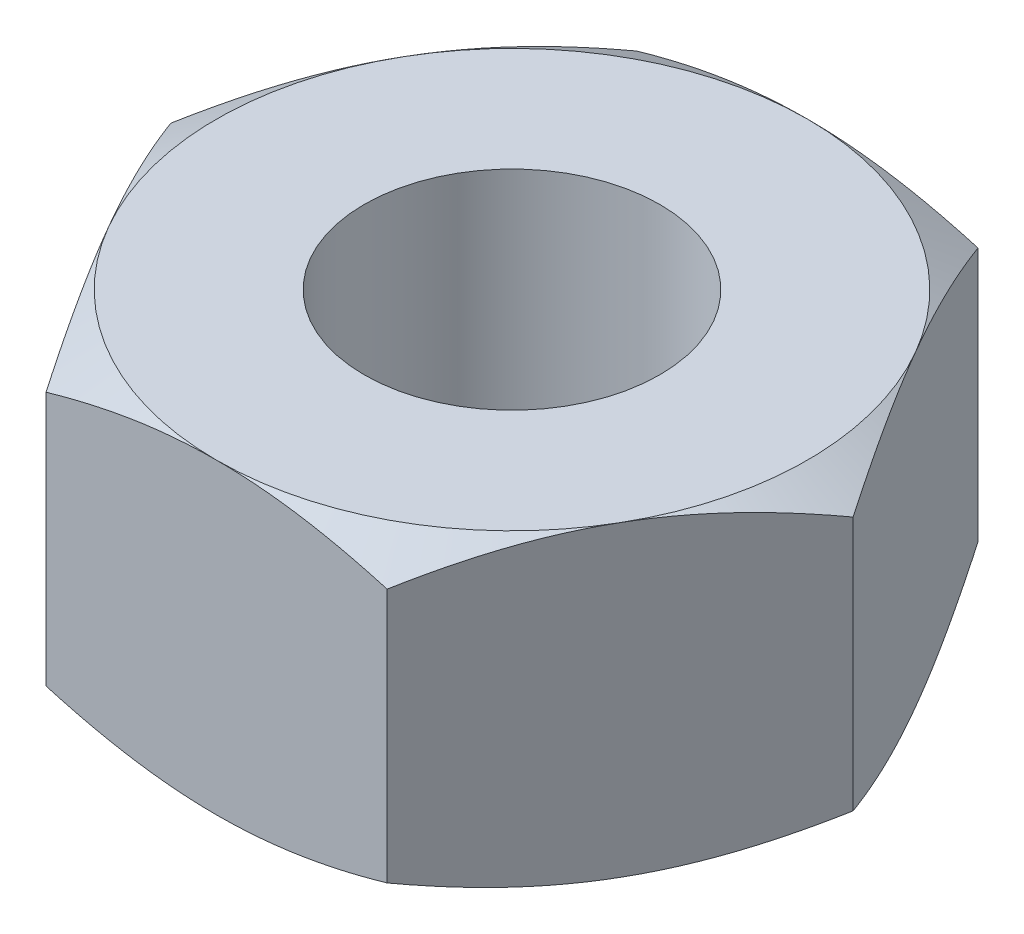
ISO-10303-21;
HEADER;
FILE_DESCRIPTION(('STEP AP214'),'2;1');
FILE_NAME('part.step','',(''),(''),'','','');
FILE_SCHEMA(('AUTOMOTIVE_DESIGN { 1 0 10303 214 1 1 1 1 }'));
ENDSEC;
DATA;
#1=APPLICATION_CONTEXT('core data for automotive mechanical design processes');
#2=APPLICATION_PROTOCOL_DEFINITION('international standard','automotive_design',2000,#1);
#3=PRODUCT_CONTEXT('',#1,'mechanical');
#4=PRODUCT('Part','Part','',(#3));
#5=PRODUCT_RELATED_PRODUCT_CATEGORY('part','',(#4));
#6=PRODUCT_DEFINITION_FORMATION('','',#4);
#7=PRODUCT_DEFINITION_CONTEXT('part definition',#1,'design');
#8=PRODUCT_DEFINITION('design','',#6,#7);
#9=PRODUCT_DEFINITION_SHAPE('','',#8);
#10=(LENGTH_UNIT() NAMED_UNIT(*) SI_UNIT(.MILLI.,.METRE.));
#11=(NAMED_UNIT(*) PLANE_ANGLE_UNIT() SI_UNIT($,.RADIAN.));
#12=(NAMED_UNIT(*) SI_UNIT($,.STERADIAN.) SOLID_ANGLE_UNIT());
#13=UNCERTAINTY_MEASURE_WITH_UNIT(LENGTH_MEASURE(1.E-05),#10,'distance_accuracy_value','');
#14=(GEOMETRIC_REPRESENTATION_CONTEXT(3) GLOBAL_UNCERTAINTY_ASSIGNED_CONTEXT((#13)) GLOBAL_UNIT_ASSIGNED_CONTEXT((#10,
#11,#12)) REPRESENTATION_CONTEXT('',''));
#15=CARTESIAN_POINT('',(0.,0.,0.));
#16=DIRECTION('',(0.,0.,1.));
#17=DIRECTION('',(1.,0.,0.));
#18=AXIS2_PLACEMENT_3D('',#15,#16,#17);
#19=CARTESIAN_POINT('',(0.,-2.6,0.));
#20=DIRECTION('',(0.,1.,0.));
#21=DIRECTION('',(0.,0.,1.));
#22=AXIS2_PLACEMENT_3D('',#19,#20,#21);
#23=PLANE('',#22);
#24=CARTESIAN_POINT('',(0.,-2.6,0.));
#25=DIRECTION('',(0.,1.,0.));
#26=DIRECTION('',(0.,0.,1.));
#27=AXIS2_PLACEMENT_3D('',#24,#25,#26);
#28=CIRCLE('',#27,2.5);
#29=CARTESIAN_POINT('',(0.,-2.6,2.5));
#30=VERTEX_POINT('',#29);
#31=EDGE_CURVE('E337',#30,#30,#28,.T.);
#32=ORIENTED_EDGE('',*,*,#31,.T.);
#33=EDGE_LOOP('',(#32));
#34=FACE_BOUND('',#33,.T.);
#35=CARTESIAN_POINT('',(0.,-2.6,0.));
#36=DIRECTION('',(0.,1.,0.));
#37=DIRECTION('',(0.,0.,1.));
#38=AXIS2_PLACEMENT_3D('',#35,#36,#37);
#39=CIRCLE('',#38,5.);
#40=CARTESIAN_POINT('',(4.3301270189222,-2.6,2.5));
#41=VERTEX_POINT('',#40);
#42=CARTESIAN_POINT('',(0.,-2.6,5.));
#43=VERTEX_POINT('',#42);
#44=EDGE_CURVE('E70',#41,#43,#39,.F.);
#45=ORIENTED_EDGE('',*,*,#44,.T.);
#46=CARTESIAN_POINT('',(-4.3301270189222,-2.6,2.5));
#47=VERTEX_POINT('',#46);
#48=EDGE_CURVE('E148',#43,#47,#39,.F.);
#49=ORIENTED_EDGE('',*,*,#48,.T.);
#50=CARTESIAN_POINT('',(-4.3301270189222,-2.6,-2.50000000000001));
#51=VERTEX_POINT('',#50);
#52=EDGE_CURVE('E286',#47,#51,#39,.F.);
#53=ORIENTED_EDGE('',*,*,#52,.T.);
#54=CARTESIAN_POINT('',(0.,-2.6,-5.00000000000001));
#55=VERTEX_POINT('',#54);
#56=EDGE_CURVE('E291',#51,#55,#39,.F.);
#57=ORIENTED_EDGE('',*,*,#56,.T.);
#58=CARTESIAN_POINT('',(4.33012701892219,-2.6,-2.5));
#59=VERTEX_POINT('',#58);
#60=EDGE_CURVE('E288',#55,#59,#39,.F.);
#61=ORIENTED_EDGE('',*,*,#60,.T.);
#62=EDGE_CURVE('E283',#59,#41,#39,.F.);
#63=ORIENTED_EDGE('',*,*,#62,.T.);
#64=EDGE_LOOP('',(#45,#49,#53,#57,#61,#63));
#65=FACE_BOUND('',#64,.T.);
#66=ADVANCED_FACE('F48',(#34,#65),#23,.F.);
#67=CARTESIAN_POINT('',(0.,2.6,0.));
#68=DIRECTION('',(0.,1.,0.));
#69=DIRECTION('',(0.,0.,1.));
#70=AXIS2_PLACEMENT_3D('',#67,#68,#69);
#71=PLANE('',#70);
#72=CARTESIAN_POINT('',(0.,2.6,0.));
#73=DIRECTION('',(0.,1.,0.));
#74=DIRECTION('',(0.,0.,1.));
#75=AXIS2_PLACEMENT_3D('',#72,#73,#74);
#76=CIRCLE('',#75,2.5);
#77=CARTESIAN_POINT('',(0.,2.6,2.5));
#78=VERTEX_POINT('',#77);
#79=EDGE_CURVE('E168',#78,#78,#76,.T.);
#80=ORIENTED_EDGE('',*,*,#79,.F.);
#81=EDGE_LOOP('',(#80));
#82=FACE_BOUND('',#81,.T.);
#83=CARTESIAN_POINT('',(0.,2.6,0.));
#84=DIRECTION('',(0.,1.,0.));
#85=DIRECTION('',(0.,0.,1.));
#86=AXIS2_PLACEMENT_3D('',#83,#84,#85);
#87=CIRCLE('',#86,5.);
#88=CARTESIAN_POINT('',(0.,2.6,5.));
#89=VERTEX_POINT('',#88);
#90=CARTESIAN_POINT('',(-4.3301270189222,2.6,2.5));
#91=VERTEX_POINT('',#90);
#92=EDGE_CURVE('E328',#89,#91,#87,.F.);
#93=ORIENTED_EDGE('',*,*,#92,.F.);
#94=CARTESIAN_POINT('',(4.3301270189222,2.6,2.5));
#95=VERTEX_POINT('',#94);
#96=EDGE_CURVE('E331',#95,#89,#87,.F.);
#97=ORIENTED_EDGE('',*,*,#96,.F.);
#98=CARTESIAN_POINT('',(4.33012701892219,2.6,-2.5));
#99=VERTEX_POINT('',#98);
#100=EDGE_CURVE('E344',#99,#95,#87,.F.);
#101=ORIENTED_EDGE('',*,*,#100,.F.);
#102=CARTESIAN_POINT('',(0.,2.6,-5.00000000000001));
#103=VERTEX_POINT('',#102);
#104=EDGE_CURVE('E341',#103,#99,#87,.F.);
#105=ORIENTED_EDGE('',*,*,#104,.F.);
#106=CARTESIAN_POINT('',(-4.3301270189222,2.6,-2.50000000000001));
#107=VERTEX_POINT('',#106);
#108=EDGE_CURVE('E339',#107,#103,#87,.F.);
#109=ORIENTED_EDGE('',*,*,#108,.F.);
#110=EDGE_CURVE('E333',#91,#107,#87,.F.);
#111=ORIENTED_EDGE('',*,*,#110,.F.);
#112=EDGE_LOOP('',(#93,#97,#101,#105,#109,#111));
#113=FACE_BOUND('',#112,.T.);
#114=ADVANCED_FACE('F329',(#82,#113),#71,.T.);
#115=CARTESIAN_POINT('',(2.88675134594813,2.6,5.));
#116=DIRECTION('',(-0.866025403784439,0.,-0.5));
#117=DIRECTION('',(-0.5,0.,0.866025403784439));
#118=AXIS2_PLACEMENT_3D('',#115,#116,#117);
#119=PLANE('',#118);
#120=DIRECTION('',(0.,-1.,0.));
#121=VECTOR('',#120,1.);
#122=CARTESIAN_POINT('',(2.88675134594813,2.6,5.));
#123=LINE('',#122,#121);
#124=CARTESIAN_POINT('',(2.88675134594831,2.1534180126149,5.));
#125=VERTEX_POINT('',#124);
#126=CARTESIAN_POINT('',(2.88675134594813,-2.1534180126148,5.));
#127=VERTEX_POINT('',#126);
#128=EDGE_CURVE('E163',#125,#127,#123,.T.);
#129=ORIENTED_EDGE('',*,*,#128,.T.);
#130=CARTESIAN_POINT('',(2.88663587589429,-2.15335134394817,5.0002));
#131=CARTESIAN_POINT('',(3.01349970319368,-2.22661343236236,4.78046540547482));
#132=CARTESIAN_POINT('',(3.14144859993849,-2.29324867808191,4.55885141554042));
#133=CARTESIAN_POINT('',(3.39956193532121,-2.40956100898919,4.11178600454649));
#134=CARTESIAN_POINT('',(3.52973095989718,-2.45919695008421,3.88632664040923));
#135=CARTESIAN_POINT('',(3.78847564779798,-2.5364489745813,3.43816769477649));
#136=CARTESIAN_POINT('',(3.91701101576052,-2.56457962171651,3.21553790689581));
#137=CARTESIAN_POINT('',(4.11026620624322,-2.58980507804632,2.88081009815336));
#138=CARTESIAN_POINT('',(4.17472868879311,-2.59538654023052,2.76915780319494));
#139=CARTESIAN_POINT('',(4.30371322717528,-2.60079778324853,2.5457500293262));
#140=CARTESIAN_POINT('',(4.36823528110589,-2.6006277417418,2.43399455370969));
#141=CARTESIAN_POINT('',(4.54500768479194,-2.59224636820796,2.12781576914936));
#142=CARTESIAN_POINT('',(4.65719946015292,-2.57817022810275,1.93349391403279));
#143=CARTESIAN_POINT('',(4.88083840557981,-2.53353474289057,1.54613989800229));
#144=CARTESIAN_POINT('',(4.9922847895602,-2.50296013985249,1.35310909862843));
#145=CARTESIAN_POINT('',(5.21637431361295,-2.42653150637884,0.964974657525144));
#146=CARTESIAN_POINT('',(5.32898917185759,-2.38035362112132,0.769920001358263));
#147=CARTESIAN_POINT('',(5.55253939626498,-2.27554820550807,0.38271965464123));
#148=CARTESIAN_POINT('',(5.66347762579592,-2.21694529656263,0.190569004591911));
#149=CARTESIAN_POINT('',(5.7736181619501,-2.15335134394817,-0.000200000000002971));
#150=B_SPLINE_CURVE_WITH_KNOTS('',3,(#130,#131,#132,#133,#134,#135,#136,#137,#138,#139,#140,
#141,#142,#143,#144,#145,#146,#147,#148,#149),.UNSPECIFIED.,.F.,.F.,(4,2,2,2,2,2,2,2,2,4),(0.,
0.792555841363092,1.58701660053334,2.36181537487281,2.74884076077326,3.13585419177295,
3.8096236259968,4.4840172390119,5.17336882348929,5.86136694793726),.UNSPECIFIED.);
#151=EDGE_CURVE('E282',#127,#41,#150,.T.);
#152=ORIENTED_EDGE('',*,*,#151,.T.);
#153=CARTESIAN_POINT('',(5.77350269189626,-2.1534180126148,0.));
#154=VERTEX_POINT('',#153);
#155=EDGE_CURVE('E276',#41,#154,#150,.T.);
#156=ORIENTED_EDGE('',*,*,#155,.T.);
#157=DIRECTION('',(0.,-1.,0.));
#158=VECTOR('',#157,1.);
#159=CARTESIAN_POINT('',(5.77350269189626,2.6,0.));
#160=LINE('',#159,#158);
#161=CARTESIAN_POINT('',(5.77350269189626,2.1534180126148,0.));
#162=VERTEX_POINT('',#161);
#163=EDGE_CURVE('E177',#162,#154,#160,.T.);
#164=ORIENTED_EDGE('',*,*,#163,.F.);
#165=CARTESIAN_POINT('',(5.7736181619501,2.15335134394817,-0.000200000000003321));
#166=CARTESIAN_POINT('',(5.64675433465071,2.22661343236237,0.219534594525182));
#167=CARTESIAN_POINT('',(5.5188054379059,2.29324867808191,0.441148584459577));
#168=CARTESIAN_POINT('',(5.26069210252318,2.40956100898919,0.88821399545351));
#169=CARTESIAN_POINT('',(5.13052307794721,2.45919695008421,1.11367335959077));
#170=CARTESIAN_POINT('',(4.87177839004641,2.5364489745813,1.56183230522351));
#171=CARTESIAN_POINT('',(4.74324302208387,2.56457962171651,1.78446209310419));
#172=CARTESIAN_POINT('',(4.54998783160116,2.58980507804632,2.11918990184664));
#173=CARTESIAN_POINT('',(4.48552534905128,2.59538654023052,2.23084219680506));
#174=CARTESIAN_POINT('',(4.35654081066911,2.60079778324853,2.4542499706738));
#175=CARTESIAN_POINT('',(4.2920187567385,2.6006277417418,2.56600544629031));
#176=CARTESIAN_POINT('',(4.11524635305245,2.59224636820796,2.87218423085064));
#177=CARTESIAN_POINT('',(4.00305457769146,2.57817022810275,3.06650608596721));
#178=CARTESIAN_POINT('',(3.77941563226457,2.53353474289057,3.45386010199771));
#179=CARTESIAN_POINT('',(3.66796924828419,2.50296013985249,3.64689090137157));
#180=CARTESIAN_POINT('',(3.44387972423144,2.42653150637884,4.03502534247486));
#181=CARTESIAN_POINT('',(3.3312648659868,2.38035362112132,4.23007999864174));
#182=CARTESIAN_POINT('',(3.1077146415794,2.27554820550807,4.61728034535877));
#183=CARTESIAN_POINT('',(2.99677641204847,2.21694529656263,4.80943099540809));
#184=CARTESIAN_POINT('',(2.88663587589429,2.15335134394817,5.0002));
#185=B_SPLINE_CURVE_WITH_KNOTS('',3,(#165,#166,#167,#168,#169,#170,#171,#172,#173,#174,#175,
#176,#177,#178,#179,#180,#181,#182,#183,#184),.UNSPECIFIED.,.F.,.F.,(4,2,2,2,2,2,2,2,2,4),(0.,
0.792555841363091,1.58701660053333,2.36181537487281,2.74884076077325,3.13585419177295,
3.80962362599679,4.4840172390119,5.17336882348929,5.86136694793726),.UNSPECIFIED.);
#186=EDGE_CURVE('E340',#162,#95,#185,.T.);
#187=ORIENTED_EDGE('',*,*,#186,.T.);
#188=EDGE_CURVE('E215',#95,#125,#185,.T.);
#189=ORIENTED_EDGE('',*,*,#188,.T.);
#190=EDGE_LOOP('',(#129,#152,#156,#164,#187,#189));
#191=FACE_BOUND('',#190,.T.);
#192=ADVANCED_FACE('F50',(#191),#119,.F.);
#193=CARTESIAN_POINT('',(5.77350269189626,2.6,0.));
#194=DIRECTION('',(-0.866025403784438,0.,0.5));
#195=DIRECTION('',(0.5,0.,0.866025403784438));
#196=AXIS2_PLACEMENT_3D('',#193,#194,#195);
#197=PLANE('',#196);
#198=ORIENTED_EDGE('',*,*,#163,.T.);
#199=CARTESIAN_POINT('',(5.7736181619501,-2.15335134394817,0.000199999999996718));
#200=CARTESIAN_POINT('',(5.64675433465071,-2.22661343236237,-0.219534594525188));
#201=CARTESIAN_POINT('',(5.5188054379059,-2.29324867808191,-0.441148584459584));
#202=CARTESIAN_POINT('',(5.26069210252318,-2.40956100898919,-0.888213995453517));
#203=CARTESIAN_POINT('',(5.13052307794721,-2.45919695008421,-1.11367335959078));
#204=CARTESIAN_POINT('',(4.87177839004641,-2.5364489745813,-1.56183230522351));
#205=CARTESIAN_POINT('',(4.74324302208387,-2.56457962171651,-1.7844620931042));
#206=CARTESIAN_POINT('',(4.54998783160116,-2.58980507804632,-2.11918990184664));
#207=CARTESIAN_POINT('',(4.48552534905128,-2.59538654023052,-2.23084219680506));
#208=CARTESIAN_POINT('',(4.35654081066911,-2.60079778324853,-2.4542499706738));
#209=CARTESIAN_POINT('',(4.2920187567385,-2.6006277417418,-2.56600544629032));
#210=CARTESIAN_POINT('',(4.11524635305244,-2.59224636820796,-2.87218423085064));
#211=CARTESIAN_POINT('',(4.00305457769146,-2.57817022810275,-3.06650608596722));
#212=CARTESIAN_POINT('',(3.77941563226457,-2.53353474289057,-3.45386010199771));
#213=CARTESIAN_POINT('',(3.66796924828418,-2.50296013985249,-3.64689090137158));
#214=CARTESIAN_POINT('',(3.44387972423144,-2.42653150637884,-4.03502534247486));
#215=CARTESIAN_POINT('',(3.3312648659868,-2.38035362112132,-4.23007999864174));
#216=CARTESIAN_POINT('',(3.1077146415794,-2.27554820550807,-4.61728034535878));
#217=CARTESIAN_POINT('',(2.99677641204847,-2.21694529656263,-4.80943099540809));
#218=CARTESIAN_POINT('',(2.88663587589429,-2.15335134394817,-5.00020000000001));
#219=B_SPLINE_CURVE_WITH_KNOTS('',3,(#199,#200,#201,#202,#203,#204,#205,#206,#207,#208,#209,
#210,#211,#212,#213,#214,#215,#216,#217,#218),.UNSPECIFIED.,.F.,.F.,(4,2,2,2,2,2,2,2,2,4),(0.,
0.792555841363091,1.58701660053333,2.36181537487281,2.74884076077325,3.13585419177295,
3.80962362599679,4.4840172390119,5.17336882348929,5.86136694793726),.UNSPECIFIED.);
#220=EDGE_CURVE('E275',#154,#59,#219,.T.);
#221=ORIENTED_EDGE('',*,*,#220,.T.);
#222=CARTESIAN_POINT('',(2.88675134594831,-2.15341801261491,-5.00000000000001));
#223=VERTEX_POINT('',#222);
#224=EDGE_CURVE('E268',#59,#223,#219,.T.);
#225=ORIENTED_EDGE('',*,*,#224,.T.);
#226=DIRECTION('',(0.,-1.,0.));
#227=VECTOR('',#226,1.);
#228=CARTESIAN_POINT('',(2.88675134594812,2.6,-5.00000000000001));
#229=LINE('',#228,#227);
#230=CARTESIAN_POINT('',(2.88675134594813,2.1534180126148,-5.00000000000001));
#231=VERTEX_POINT('',#230);
#232=EDGE_CURVE('E174',#231,#223,#229,.T.);
#233=ORIENTED_EDGE('',*,*,#232,.F.);
#234=CARTESIAN_POINT('',(2.88663587589429,2.15335134394817,-5.00020000000001));
#235=CARTESIAN_POINT('',(3.01349970319368,2.22661343236237,-4.78046540547482));
#236=CARTESIAN_POINT('',(3.14144859993849,2.29324867808191,-4.55885141554043));
#237=CARTESIAN_POINT('',(3.3995619353212,2.40956100898919,-4.11178600454649));
#238=CARTESIAN_POINT('',(3.52973095989717,2.45919695008421,-3.88632664040923));
#239=CARTESIAN_POINT('',(3.78847564779797,2.5364489745813,-3.4381676947765));
#240=CARTESIAN_POINT('',(3.91701101576052,2.56457962171651,-3.21553790689582));
#241=CARTESIAN_POINT('',(4.11026620624322,2.58980507804632,-2.88081009815337));
#242=CARTESIAN_POINT('',(4.1747286887931,2.59538654023052,-2.76915780319495));
#243=CARTESIAN_POINT('',(4.30371322717527,2.60079778324853,-2.54575002932621));
#244=CARTESIAN_POINT('',(4.36823528110588,2.6006277417418,-2.43399455370969));
#245=CARTESIAN_POINT('',(4.54500768479194,2.59224636820797,-2.12781576914937));
#246=CARTESIAN_POINT('',(4.65719946015292,2.57817022810275,-1.93349391403279));
#247=CARTESIAN_POINT('',(4.88083840557981,2.53353474289057,-1.5461398980023));
#248=CARTESIAN_POINT('',(4.9922847895602,2.50296013985249,-1.35310909862843));
#249=CARTESIAN_POINT('',(5.21637431361295,2.42653150637884,-0.96497465752515));
#250=CARTESIAN_POINT('',(5.32898917185759,2.38035362112132,-0.769920001358269));
#251=CARTESIAN_POINT('',(5.55253939626498,2.27554820550807,-0.382719654641236));
#252=CARTESIAN_POINT('',(5.66347762579592,2.21694529656263,-0.190569004591917));
#253=CARTESIAN_POINT('',(5.7736181619501,2.15335134394817,0.000199999999996386));
#254=B_SPLINE_CURVE_WITH_KNOTS('',3,(#234,#235,#236,#237,#238,#239,#240,#241,#242,#243,#244,
#245,#246,#247,#248,#249,#250,#251,#252,#253),.UNSPECIFIED.,.F.,.F.,(4,2,2,2,2,2,2,2,2,4),(0.,
0.792555841363091,1.58701660053333,2.36181537487281,2.74884076077325,3.13585419177295,
3.80962362599679,4.4840172390119,5.17336882348929,5.86136694793726),.UNSPECIFIED.);
#255=EDGE_CURVE('E343',#231,#99,#254,.T.);
#256=ORIENTED_EDGE('',*,*,#255,.T.);
#257=EDGE_CURVE('E236',#99,#162,#254,.T.);
#258=ORIENTED_EDGE('',*,*,#257,.T.);
#259=EDGE_LOOP('',(#198,#221,#225,#233,#256,#258));
#260=FACE_BOUND('',#259,.T.);
#261=ADVANCED_FACE('F247',(#260),#197,.F.);
#262=CARTESIAN_POINT('',(2.88675134594812,2.6,-5.00000000000001));
#263=DIRECTION('',(0.,0.,1.));
#264=DIRECTION('',(1.,0.,0.));
#265=AXIS2_PLACEMENT_3D('',#262,#263,#264);
#266=PLANE('',#265);
#267=ORIENTED_EDGE('',*,*,#232,.T.);
#268=CARTESIAN_POINT('',(8.68206422951936,0.297659868269469,-5.00000000000001));
#269=CARTESIAN_POINT('',(8.47428305688437,0.193720289623196,-5.00000000000001));
#270=CARTESIAN_POINT('',(8.26613947656045,0.0904975817921647,-5.00000000000001));
#271=CARTESIAN_POINT('',(7.84896229385708,-0.114167625846774,-5.00000000000001));
#272=CARTESIAN_POINT('',(7.63992863300732,-0.215610006389311,-5.00000000000001));
#273=CARTESIAN_POINT('',(7.22041164729664,-0.416556322610966,-5.00000000000001));
#274=CARTESIAN_POINT('',(7.00992625040475,-0.516055941674958,-5.00000000000001));
#275=CARTESIAN_POINT('',(6.58773455250518,-0.712424442896547,-5.00000000000001));
#276=CARTESIAN_POINT('',(6.37602827548685,-0.809293376533008,-5.00000000000001));
#277=CARTESIAN_POINT('',(5.94159356177615,-1.00408249287233,-5.00000000000001));
#278=CARTESIAN_POINT('',(5.71879806368149,-1.10185360217002,-5.00000000000001));
#279=CARTESIAN_POINT('',(5.2713085900937,-1.29294591925907,-5.00000000000001));
#280=CARTESIAN_POINT('',(5.04661468104624,-1.38626728204127,-5.00000000000001));
#281=CARTESIAN_POINT('',(4.5950821627473,-1.56721217546039,-5.00000000000001));
#282=CARTESIAN_POINT('',(4.36824487713406,-1.6548389890308,-5.00000000000001));
#283=CARTESIAN_POINT('',(3.91191998437999,-1.82286198618225,-5.00000000000001));
#284=CARTESIAN_POINT('',(3.6824326706301,-1.90325896169763,-5.00000000000001));
#285=CARTESIAN_POINT('',(3.16627906942595,-2.0725577227667,-5.00000000000001));
#286=CARTESIAN_POINT('',(2.8788076982066,-2.15904220659813,-5.00000000000001));
#287=CARTESIAN_POINT('',(2.29868091058497,-2.313014793433,-5.00000000000001));
#288=CARTESIAN_POINT('',(2.00602595868864,-2.38050458950695,-5.00000000000001));
#289=CARTESIAN_POINT('',(1.5660731000072,-2.46275050587615,-5.00000000000001));
#290=CARTESIAN_POINT('',(1.42051024544645,-2.48687314862229,-5.00000000000001));
#291=CARTESIAN_POINT('',(1.12845176513283,-2.52852001853092,-5.00000000000001));
#292=CARTESIAN_POINT('',(0.981956277323201,-2.54604519946152,-5.00000000000001));
#293=CARTESIAN_POINT('',(0.68832530279011,-2.57397304461568,-5.00000000000001));
#294=CARTESIAN_POINT('',(0.541190013205562,-2.5843777652311,-5.00000000000001));
#295=CARTESIAN_POINT('',(0.246578432655686,-2.59773536616967,-5.00000000000001));
#296=CARTESIAN_POINT('',(0.0991021431409473,-2.60068827813415,-5.00000000000001));
#297=CARTESIAN_POINT('',(-0.196695432728998,-2.59903680388877,-5.00000000000001));
#298=CARTESIAN_POINT('',(-0.345016463812866,-2.59438683570571,-5.00000000000001));
#299=CARTESIAN_POINT('',(-0.64123024252682,-2.57760218687671,-5.00000000000001));
#300=CARTESIAN_POINT('',(-0.789122988251339,-2.56546747298021,-5.00000000000001));
#301=CARTESIAN_POINT('',(-1.0842043075351,-2.53409970856636,-5.00000000000001));
#302=CARTESIAN_POINT('',(-1.23139259321528,-2.51486397165611,-5.00000000000001));
#303=CARTESIAN_POINT('',(-1.52475895233518,-2.46986112262494,-5.00000000000001));
#304=CARTESIAN_POINT('',(-1.67093699024304,-2.44409378196713,-5.00000000000001));
#305=CARTESIAN_POINT('',(-2.11263855303367,-2.35701200859897,-5.00000000000001));
#306=CARTESIAN_POINT('',(-2.40635953125808,-2.28648407585268,-5.00000000000001));
#307=CARTESIAN_POINT('',(-2.98872405904261,-2.12686296011783,-5.00000000000001));
#308=CARTESIAN_POINT('',(-3.27736464944715,-2.0377593217417,-5.00000000000001));
#309=CARTESIAN_POINT('',(-3.78939172856961,-1.86617105419252,-5.00000000000001));
#310=CARTESIAN_POINT('',(-4.01365934925689,-1.78627699262495,-5.00000000000001));
#311=CARTESIAN_POINT('',(-4.45962522043236,-1.61982739234694,-5.00000000000001));
#312=CARTESIAN_POINT('',(-4.68132415934162,-1.53327368830756,-5.00000000000001));
#313=CARTESIAN_POINT('',(-5.12274042805104,-1.35485780107892,-5.00000000000001));
#314=CARTESIAN_POINT('',(-5.34245629312136,-1.26299201469958,-5.00000000000001));
#315=CARTESIAN_POINT('',(-5.78010082597279,-1.07509374329047,-5.00000000000001));
#316=CARTESIAN_POINT('',(-5.99802943693736,-0.979061126403545,-5.00000000000001));
#317=CARTESIAN_POINT('',(-6.42319856783663,-0.787797751516064,-5.00000000000001));
#318=CARTESIAN_POINT('',(-6.6305013013401,-0.692704862743588,-5.00000000000001));
#319=CARTESIAN_POINT('',(-7.04394007060159,-0.500028485969264,-5.00000000000001));
#320=CARTESIAN_POINT('',(-7.25007612441333,-0.402445036636938,-5.00000000000001));
#321=CARTESIAN_POINT('',(-7.66099948160164,-0.205406432984439,-5.00000000000001));
#322=CARTESIAN_POINT('',(-7.86578853036506,-0.105954911311079,-5.00000000000001));
#323=CARTESIAN_POINT('',(-8.27452256520176,0.0946545871090098,-5.00000000000001));
#324=CARTESIAN_POINT('',(-8.47846757467962,0.195812516138166,-5.00000000000001));
#325=CARTESIAN_POINT('',(-8.68206422951937,0.297659868269472,-5.00000000000001));
#326=B_SPLINE_CURVE_WITH_KNOTS('',3,(#268,#269,#270,#271,#272,#273,#274,#275,#276,#277,#278,
#279,#280,#281,#282,#283,#284,#285,#286,#287,#288,#289,#290,#291,#292,#293,#294,#295,#296,#297,
#298,#299,#300,#301,#302,#303,#304,#305,#306,#307,#308,#309,#310,#311,#312,#313,#314,#315,#316,
#317,#318,#319,#320,#321,#322,#323,#324,#325),.UNSPECIFIED.,.F.,.F.,(4,2,2,2,2,2,2,2,2,2,2,2,2,
2,2,2,2,2,2,2,2,2,2,2,2,2,2,2,4),(0.,0.696988663846689,1.3940238425842,2.09246318189316,
2.790888843851,3.52076369641517,4.2506131078261,4.98003795510762,5.70938280585165,
6.60952478553675,7.50958650663302,7.95210484059959,8.39455917690839,8.8368856782378,
9.27921030138989,9.72419655503197,10.169184785515,10.6143415326085,11.0595138576197,
11.9648157466118,12.8706285697146,13.5847255540857,14.2986265107883,15.013017520654,
15.7274311535566,16.4116292211718,17.0958166720863,17.77878878915,18.4617418392987),.UNSPECIFIED.);
#327=EDGE_CURVE('E261',#223,#55,#326,.T.);
#328=ORIENTED_EDGE('',*,*,#327,.T.);
#329=CARTESIAN_POINT('',(-2.88675134594813,-2.1534180126148,-5.00000000000001));
#330=VERTEX_POINT('',#329);
#331=EDGE_CURVE('E253',#55,#330,#326,.T.);
#332=ORIENTED_EDGE('',*,*,#331,.T.);
#333=DIRECTION('',(0.,-1.,0.));
#334=VECTOR('',#333,1.);
#335=CARTESIAN_POINT('',(-2.88675134594813,2.6,-5.00000000000001));
#336=LINE('',#335,#334);
#337=CARTESIAN_POINT('',(-2.88675134594813,2.1534180126148,-5.00000000000001));
#338=VERTEX_POINT('',#337);
#339=EDGE_CURVE('E165',#338,#330,#336,.T.);
#340=ORIENTED_EDGE('',*,*,#339,.F.);
#341=CARTESIAN_POINT('',(-8.68206422951937,-0.297659868269473,-5.00000000000001));
#342=CARTESIAN_POINT('',(-8.47428305688437,-0.1937202896232,-5.00000000000001));
#343=CARTESIAN_POINT('',(-8.26613947656045,-0.0904975817921696,-5.00000000000001));
#344=CARTESIAN_POINT('',(-7.84896229385709,0.11416762584677,-5.00000000000001));
#345=CARTESIAN_POINT('',(-7.63992863300732,0.215610006389308,-5.00000000000001));
#346=CARTESIAN_POINT('',(-7.22041164729664,0.416556322610964,-5.00000000000001));
#347=CARTESIAN_POINT('',(-7.00992625040476,0.516055941674955,-5.00000000000001));
#348=CARTESIAN_POINT('',(-6.58773455250518,0.712424442896545,-5.00000000000001));
#349=CARTESIAN_POINT('',(-6.37602827548685,0.809293376533006,-5.00000000000001));
#350=CARTESIAN_POINT('',(-5.94159356177615,1.00408249287233,-5.00000000000001));
#351=CARTESIAN_POINT('',(-5.71879806368149,1.10185360217002,-5.00000000000001));
#352=CARTESIAN_POINT('',(-5.2713085900937,1.29294591925907,-5.00000000000001));
#353=CARTESIAN_POINT('',(-5.04661468104624,1.38626728204127,-5.00000000000001));
#354=CARTESIAN_POINT('',(-4.5950821627473,1.56721217546039,-5.00000000000001));
#355=CARTESIAN_POINT('',(-4.36824487713406,1.6548389890308,-5.00000000000001));
#356=CARTESIAN_POINT('',(-3.91191998437999,1.82286198618225,-5.00000000000001));
#357=CARTESIAN_POINT('',(-3.6824326706301,1.90325896169763,-5.00000000000001));
#358=CARTESIAN_POINT('',(-3.16627906942595,2.0725577227667,-5.00000000000001));
#359=CARTESIAN_POINT('',(-2.8788076982066,2.15904220659813,-5.00000000000001));
#360=CARTESIAN_POINT('',(-2.29868091058497,2.313014793433,-5.00000000000001));
#361=CARTESIAN_POINT('',(-2.00602595868865,2.38050458950695,-5.00000000000001));
#362=CARTESIAN_POINT('',(-1.5660731000072,2.46275050587615,-5.00000000000001));
#363=CARTESIAN_POINT('',(-1.42051024544645,2.48687314862229,-5.00000000000001));
#364=CARTESIAN_POINT('',(-1.12845176513282,2.52852001853092,-5.00000000000001));
#365=CARTESIAN_POINT('',(-0.981956277323202,2.54604519946152,-5.00000000000001));
#366=CARTESIAN_POINT('',(-0.688325302790111,2.57397304461568,-5.00000000000001));
#367=CARTESIAN_POINT('',(-0.541190013205563,2.5843777652311,-5.00000000000001));
#368=CARTESIAN_POINT('',(-0.246578432655687,2.59773536616967,-5.00000000000001));
#369=CARTESIAN_POINT('',(-0.0991021431409482,2.60068827813415,-5.00000000000001));
#370=CARTESIAN_POINT('',(0.196695432728998,2.59903680388877,-5.00000000000001));
#371=CARTESIAN_POINT('',(0.345016463812865,2.59438683570571,-5.00000000000001));
#372=CARTESIAN_POINT('',(0.641230242526819,2.57760218687671,-5.00000000000001));
#373=CARTESIAN_POINT('',(0.789122988251338,2.56546747298021,-5.00000000000001));
#374=CARTESIAN_POINT('',(1.0842043075351,2.53409970856636,-5.00000000000001));
#375=CARTESIAN_POINT('',(1.23139259321528,2.51486397165611,-5.00000000000001));
#376=CARTESIAN_POINT('',(1.52475895233518,2.46986112262494,-5.00000000000001));
#377=CARTESIAN_POINT('',(1.67093699024304,2.44409378196713,-5.00000000000001));
#378=CARTESIAN_POINT('',(2.11263855303367,2.35701200859897,-5.00000000000001));
#379=CARTESIAN_POINT('',(2.40635953125808,2.28648407585268,-5.00000000000001));
#380=CARTESIAN_POINT('',(2.98872405904261,2.12686296011783,-5.00000000000001));
#381=CARTESIAN_POINT('',(3.27736464944715,2.0377593217417,-5.00000000000001));
#382=CARTESIAN_POINT('',(3.78939172856961,1.86617105419252,-5.00000000000001));
#383=CARTESIAN_POINT('',(4.01365934925689,1.78627699262495,-5.00000000000001));
#384=CARTESIAN_POINT('',(4.45962522043236,1.61982739234694,-5.00000000000001));
#385=CARTESIAN_POINT('',(4.68132415934162,1.53327368830756,-5.00000000000001));
#386=CARTESIAN_POINT('',(5.12274042805103,1.35485780107892,-5.00000000000001));
#387=CARTESIAN_POINT('',(5.34245629312135,1.26299201469958,-5.00000000000001));
#388=CARTESIAN_POINT('',(5.78010082597279,1.07509374329047,-5.00000000000001));
#389=CARTESIAN_POINT('',(5.99802943693735,0.979061126403548,-5.00000000000001));
#390=CARTESIAN_POINT('',(6.42319856783662,0.787797751516067,-5.00000000000001));
#391=CARTESIAN_POINT('',(6.63050130134009,0.692704862743592,-5.00000000000001));
#392=CARTESIAN_POINT('',(7.04394007060158,0.500028485969268,-5.00000000000001));
#393=CARTESIAN_POINT('',(7.25007612441332,0.402445036636941,-5.00000000000001));
#394=CARTESIAN_POINT('',(7.66099948160163,0.205406432984442,-5.00000000000001));
#395=CARTESIAN_POINT('',(7.86578853036505,0.105954911311083,-5.00000000000001));
#396=CARTESIAN_POINT('',(8.27452256520176,-0.094654587109006,-5.00000000000001));
#397=CARTESIAN_POINT('',(8.47846757467961,-0.195812516138163,-5.00000000000001));
#398=CARTESIAN_POINT('',(8.68206422951936,-0.297659868269469,-5.00000000000001));
#399=B_SPLINE_CURVE_WITH_KNOTS('',3,(#341,#342,#343,#344,#345,#346,#347,#348,#349,#350,#351,
#352,#353,#354,#355,#356,#357,#358,#359,#360,#361,#362,#363,#364,#365,#366,#367,#368,#369,#370,
#371,#372,#373,#374,#375,#376,#377,#378,#379,#380,#381,#382,#383,#384,#385,#386,#387,#388,#389,
#390,#391,#392,#393,#394,#395,#396,#397,#398),.UNSPECIFIED.,.F.,.F.,(4,2,2,2,2,2,2,2,2,2,2,2,2,
2,2,2,2,2,2,2,2,2,2,2,2,2,2,2,4),(0.,0.696988663846689,1.3940238425842,2.09246318189316,
2.790888843851,3.52076369641517,4.2506131078261,4.98003795510763,5.70938280585166,
6.60952478553675,7.50958650663303,7.9521048405996,8.3945591769084,8.83688567823781,
9.27921030138989,9.72419655503197,10.169184785515,10.6143415326085,11.0595138576197,
11.9648157466118,12.8706285697146,13.5847255540857,14.2986265107883,15.013017520654,
15.7274311535566,16.4116292211718,17.0958166720863,17.77878878915,18.4617418392987),.UNSPECIFIED.);
#400=EDGE_CURVE('E229',#338,#103,#399,.T.);
#401=ORIENTED_EDGE('',*,*,#400,.T.);
#402=EDGE_CURVE('E237',#103,#231,#399,.T.);
#403=ORIENTED_EDGE('',*,*,#402,.T.);
#404=EDGE_LOOP('',(#267,#328,#332,#340,#401,#403));
#405=FACE_BOUND('',#404,.T.);
#406=ADVANCED_FACE('F243',(#405),#266,.F.);
#407=CARTESIAN_POINT('',(-2.88675134594813,2.6,-5.00000000000001));
#408=DIRECTION('',(0.866025403784439,0.,0.5));
#409=DIRECTION('',(0.5,0.,-0.866025403784439));
#410=AXIS2_PLACEMENT_3D('',#407,#408,#409);
#411=PLANE('',#410);
#412=ORIENTED_EDGE('',*,*,#339,.T.);
#413=CARTESIAN_POINT('',(-2.88663587589429,-2.15335134394817,-5.00020000000001));
#414=CARTESIAN_POINT('',(-3.01349970319368,-2.22661343236236,-4.78046540547482));
#415=CARTESIAN_POINT('',(-3.14144859993849,-2.29324867808191,-4.55885141554043));
#416=CARTESIAN_POINT('',(-3.39956193532121,-2.40956100898919,-4.11178600454649));
#417=CARTESIAN_POINT('',(-3.52973095989718,-2.45919695008421,-3.88632664040923));
#418=CARTESIAN_POINT('',(-3.78847564779798,-2.5364489745813,-3.4381676947765));
#419=CARTESIAN_POINT('',(-3.91701101576052,-2.56457962171651,-3.21553790689581));
#420=CARTESIAN_POINT('',(-4.11026620624323,-2.58980507804632,-2.88081009815336));
#421=CARTESIAN_POINT('',(-4.17472868879311,-2.59538654023051,-2.76915780319495));
#422=CARTESIAN_POINT('',(-4.30371322717528,-2.60079778324853,-2.54575002932621));
#423=CARTESIAN_POINT('',(-4.36823528110589,-2.6006277417418,-2.43399455370969));
#424=CARTESIAN_POINT('',(-4.54500768479195,-2.59224636820796,-2.12781576914937));
#425=CARTESIAN_POINT('',(-4.65719946015293,-2.57817022810275,-1.93349391403279));
#426=CARTESIAN_POINT('',(-4.88083840557982,-2.53353474289057,-1.5461398980023));
#427=CARTESIAN_POINT('',(-4.99228478956021,-2.50296013985249,-1.35310909862843));
#428=CARTESIAN_POINT('',(-5.21637431361295,-2.42653150637883,-0.964974657525147));
#429=CARTESIAN_POINT('',(-5.32898917185759,-2.38035362112132,-0.769920001358266));
#430=CARTESIAN_POINT('',(-5.55253939626499,-2.27554820550806,-0.382719654641232));
#431=CARTESIAN_POINT('',(-5.66347762579593,-2.21694529656262,-0.190569004591914));
#432=CARTESIAN_POINT('',(-5.7736181619501,-2.15335134394817,0.000200000000000336));
#433=B_SPLINE_CURVE_WITH_KNOTS('',3,(#413,#414,#415,#416,#417,#418,#419,#420,#421,#422,#423,
#424,#425,#426,#427,#428,#429,#430,#431,#432),.UNSPECIFIED.,.F.,.F.,(4,2,2,2,2,2,2,2,2,4),(0.,
0.792555841363092,1.58701660053334,2.36181537487281,2.74884076077326,3.13585419177295,
3.8096236259968,4.4840172390119,5.17336882348929,5.86136694793726),.UNSPECIFIED.);
#434=EDGE_CURVE('E262',#330,#51,#433,.T.);
#435=ORIENTED_EDGE('',*,*,#434,.T.);
#436=CARTESIAN_POINT('',(-5.77350269189627,-2.1534180126148,0.));
#437=VERTEX_POINT('',#436);
#438=EDGE_CURVE('E263',#51,#437,#433,.T.);
#439=ORIENTED_EDGE('',*,*,#438,.T.);
#440=DIRECTION('',(0.,-1.,0.));
#441=VECTOR('',#440,1.);
#442=CARTESIAN_POINT('',(-5.77350269189627,2.6,0.));
#443=LINE('',#442,#441);
#444=CARTESIAN_POINT('',(-5.77350269189627,2.1534180126148,0.));
#445=VERTEX_POINT('',#444);
#446=EDGE_CURVE('E162',#445,#437,#443,.T.);
#447=ORIENTED_EDGE('',*,*,#446,.F.);
#448=CARTESIAN_POINT('',(-5.7736181619501,2.15335134394817,0.000200000000000121));
#449=CARTESIAN_POINT('',(-5.64675433465072,2.22661343236236,-0.219534594525185));
#450=CARTESIAN_POINT('',(-5.5188054379059,2.29324867808191,-0.441148584459581));
#451=CARTESIAN_POINT('',(-5.26069210252319,2.40956100898919,-0.888213995453515));
#452=CARTESIAN_POINT('',(-5.13052307794722,2.45919695008421,-1.11367335959078));
#453=CARTESIAN_POINT('',(-4.87177839004642,2.5364489745813,-1.56183230522351));
#454=CARTESIAN_POINT('',(-4.74324302208387,2.56457962171651,-1.7844620931042));
#455=CARTESIAN_POINT('',(-4.54998783160117,2.58980507804631,-2.11918990184664));
#456=CARTESIAN_POINT('',(-4.48552534905129,2.59538654023052,-2.23084219680506));
#457=CARTESIAN_POINT('',(-4.35654081066912,2.60079778324853,-2.4542499706738));
#458=CARTESIAN_POINT('',(-4.29201875673851,2.6006277417418,-2.56600544629032));
#459=CARTESIAN_POINT('',(-4.11524635305245,2.59224636820796,-2.87218423085064));
#460=CARTESIAN_POINT('',(-4.00305457769147,2.57817022810275,-3.06650608596722));
#461=CARTESIAN_POINT('',(-3.77941563226458,2.53353474289057,-3.45386010199771));
#462=CARTESIAN_POINT('',(-3.66796924828419,2.50296013985249,-3.64689090137158));
#463=CARTESIAN_POINT('',(-3.44387972423144,2.42653150637884,-4.03502534247486));
#464=CARTESIAN_POINT('',(-3.3312648659868,2.38035362112132,-4.23007999864174));
#465=CARTESIAN_POINT('',(-3.10771464157941,2.27554820550806,-4.61728034535878));
#466=CARTESIAN_POINT('',(-2.99677641204847,2.21694529656263,-4.80943099540809));
#467=CARTESIAN_POINT('',(-2.88663587589429,2.15335134394817,-5.00020000000001));
#468=B_SPLINE_CURVE_WITH_KNOTS('',3,(#448,#449,#450,#451,#452,#453,#454,#455,#456,#457,#458,
#459,#460,#461,#462,#463,#464,#465,#466,#467),.UNSPECIFIED.,.F.,.F.,(4,2,2,2,2,2,2,2,2,4),(0.,
0.792555841363092,1.58701660053334,2.36181537487281,2.74884076077326,3.13585419177295,
3.8096236259968,4.4840172390119,5.17336882348929,5.86136694793726),.UNSPECIFIED.);
#469=EDGE_CURVE('E338',#445,#107,#468,.T.);
#470=ORIENTED_EDGE('',*,*,#469,.T.);
#471=EDGE_CURVE('E222',#107,#338,#468,.T.);
#472=ORIENTED_EDGE('',*,*,#471,.T.);
#473=EDGE_LOOP('',(#412,#435,#439,#447,#470,#472));
#474=FACE_BOUND('',#473,.T.);
#475=ADVANCED_FACE('F246',(#474),#411,.F.);
#476=CARTESIAN_POINT('',(-5.77350269189627,2.6,0.));
#477=DIRECTION('',(0.866025403784439,0.,-0.5));
#478=DIRECTION('',(-0.5,0.,-0.866025403784439));
#479=AXIS2_PLACEMENT_3D('',#476,#477,#478);
#480=PLANE('',#479);
#481=ORIENTED_EDGE('',*,*,#446,.T.);
#482=CARTESIAN_POINT('',(-5.7736181619501,-2.15335134394817,-0.000199999999999917));
#483=CARTESIAN_POINT('',(-5.64675433465072,-2.22661343236236,0.219534594525185));
#484=CARTESIAN_POINT('',(-5.5188054379059,-2.29324867808191,0.441148584459581));
#485=CARTESIAN_POINT('',(-5.26069210252319,-2.40956100898919,0.888213995453515));
#486=CARTESIAN_POINT('',(-5.13052307794722,-2.45919695008421,1.11367335959078));
#487=CARTESIAN_POINT('',(-4.87177839004642,-2.5364489745813,1.56183230522351));
#488=CARTESIAN_POINT('',(-4.74324302208388,-2.56457962171651,1.7844620931042));
#489=CARTESIAN_POINT('',(-4.54998783160117,-2.58980507804631,2.11918990184665));
#490=CARTESIAN_POINT('',(-4.48552534905128,-2.59538654023051,2.23084219680506));
#491=CARTESIAN_POINT('',(-4.35654081066911,-2.60079778324853,2.4542499706738));
#492=CARTESIAN_POINT('',(-4.2920187567385,-2.60062774174179,2.56600544629032));
#493=CARTESIAN_POINT('',(-4.11524635305245,-2.59224636820796,2.87218423085064));
#494=CARTESIAN_POINT('',(-4.00305457769147,-2.57817022810275,3.06650608596722));
#495=CARTESIAN_POINT('',(-3.77941563226458,-2.53353474289057,3.45386010199771));
#496=CARTESIAN_POINT('',(-3.66796924828419,-2.50296013985249,3.64689090137158));
#497=CARTESIAN_POINT('',(-3.44387972423144,-2.42653150637883,4.03502534247486));
#498=CARTESIAN_POINT('',(-3.3312648659868,-2.38035362112132,4.23007999864174));
#499=CARTESIAN_POINT('',(-3.10771464157941,-2.27554820550806,4.61728034535877));
#500=CARTESIAN_POINT('',(-2.99677641204847,-2.21694529656262,4.80943099540809));
#501=CARTESIAN_POINT('',(-2.8866358758943,-2.15335134394817,5.0002));
#502=B_SPLINE_CURVE_WITH_KNOTS('',3,(#482,#483,#484,#485,#486,#487,#488,#489,#490,#491,#492,
#493,#494,#495,#496,#497,#498,#499,#500,#501),.UNSPECIFIED.,.F.,.F.,(4,2,2,2,2,2,2,2,2,4),(0.,
0.792555841363092,1.58701660053334,2.36181537487281,2.74884076077326,3.13585419177295,
3.8096236259968,4.4840172390119,5.17336882348929,5.86136694793726),.UNSPECIFIED.);
#503=EDGE_CURVE('E155',#437,#47,#502,.T.);
#504=ORIENTED_EDGE('',*,*,#503,.T.);
#505=CARTESIAN_POINT('',(-2.88675134594832,-2.1534180126149,5.));
#506=VERTEX_POINT('',#505);
#507=EDGE_CURVE('E145',#47,#506,#502,.T.);
#508=ORIENTED_EDGE('',*,*,#507,.T.);
#509=DIRECTION('',(0.,-1.,0.));
#510=VECTOR('',#509,1.);
#511=CARTESIAN_POINT('',(-2.88675134594813,2.6,5.));
#512=LINE('',#511,#510);
#513=CARTESIAN_POINT('',(-2.88675134594813,2.1534180126148,5.));
#514=VERTEX_POINT('',#513);
#515=EDGE_CURVE('E154',#514,#506,#512,.T.);
#516=ORIENTED_EDGE('',*,*,#515,.F.);
#517=CARTESIAN_POINT('',(-2.8866358758943,2.15335134394817,5.0002));
#518=CARTESIAN_POINT('',(-3.01349970319368,2.22661343236236,4.78046540547482));
#519=CARTESIAN_POINT('',(-3.1414485999385,2.29324867808191,4.55885141554042));
#520=CARTESIAN_POINT('',(-3.39956193532121,2.40956100898919,4.11178600454649));
#521=CARTESIAN_POINT('',(-3.52973095989718,2.45919695008421,3.88632664040923));
#522=CARTESIAN_POINT('',(-3.78847564779798,2.5364489745813,3.43816769477649));
#523=CARTESIAN_POINT('',(-3.91701101576052,2.56457962171651,3.21553790689581));
#524=CARTESIAN_POINT('',(-4.11026620624323,2.58980507804631,2.88081009815336));
#525=CARTESIAN_POINT('',(-4.17472868879311,2.59538654023051,2.76915780319494));
#526=CARTESIAN_POINT('',(-4.30371322717528,2.60079778324853,2.5457500293262));
#527=CARTESIAN_POINT('',(-4.3682352811059,2.60062774174179,2.43399455370969));
#528=CARTESIAN_POINT('',(-4.54500768479195,2.59224636820796,2.12781576914936));
#529=CARTESIAN_POINT('',(-4.65719946015293,2.57817022810275,1.93349391403279));
#530=CARTESIAN_POINT('',(-4.88083840557982,2.53353474289057,1.54613989800229));
#531=CARTESIAN_POINT('',(-4.99228478956021,2.50296013985249,1.35310909862843));
#532=CARTESIAN_POINT('',(-5.21637431361296,2.42653150637883,0.964974657525145));
#533=CARTESIAN_POINT('',(-5.32898917185759,2.38035362112132,0.769920001358264));
#534=CARTESIAN_POINT('',(-5.55253939626499,2.27554820550806,0.382719654641231));
#535=CARTESIAN_POINT('',(-5.66347762579593,2.21694529656262,0.190569004591913));
#536=CARTESIAN_POINT('',(-5.7736181619501,2.15335134394817,-0.000200000000000176));
#537=B_SPLINE_CURVE_WITH_KNOTS('',3,(#517,#518,#519,#520,#521,#522,#523,#524,#525,#526,#527,
#528,#529,#530,#531,#532,#533,#534,#535,#536),.UNSPECIFIED.,.F.,.F.,(4,2,2,2,2,2,2,2,2,4),(0.,
0.792555841363092,1.58701660053334,2.36181537487281,2.74884076077326,3.13585419177295,
3.8096236259968,4.4840172390119,5.17336882348929,5.86136694793726),.UNSPECIFIED.);
#538=EDGE_CURVE('E207',#514,#91,#537,.T.);
#539=ORIENTED_EDGE('',*,*,#538,.T.);
#540=EDGE_CURVE('E290',#91,#445,#537,.T.);
#541=ORIENTED_EDGE('',*,*,#540,.T.);
#542=EDGE_LOOP('',(#481,#504,#508,#516,#539,#541));
#543=FACE_BOUND('',#542,.T.);
#544=ADVANCED_FACE('F152',(#543),#480,.F.);
#545=CARTESIAN_POINT('',(-2.88675134594813,2.6,5.));
#546=DIRECTION('',(0.,0.,-1.));
#547=DIRECTION('',(-1.,0.,0.));
#548=AXIS2_PLACEMENT_3D('',#545,#546,#547);
#549=PLANE('',#548);
#550=ORIENTED_EDGE('',*,*,#515,.T.);
#551=CARTESIAN_POINT('',(-8.68206422951937,0.297659868269478,5.));
#552=CARTESIAN_POINT('',(-8.47428305688438,0.193720289623206,5.));
#553=CARTESIAN_POINT('',(-8.26613947656046,0.0904975817921747,5.));
#554=CARTESIAN_POINT('',(-7.8489622938571,-0.114167625846765,5.));
#555=CARTESIAN_POINT('',(-7.63992863300733,-0.215610006389303,5.));
#556=CARTESIAN_POINT('',(-7.22041164729665,-0.416556322610959,5.));
#557=CARTESIAN_POINT('',(-7.00992625040477,-0.51605594167495,5.));
#558=CARTESIAN_POINT('',(-6.58773455250519,-0.712424442896539,5.));
#559=CARTESIAN_POINT('',(-6.37602827548686,-0.809293376532999,5.));
#560=CARTESIAN_POINT('',(-5.94159356177616,-1.00408249287232,5.));
#561=CARTESIAN_POINT('',(-5.7187980636815,-1.10185360217002,5.));
#562=CARTESIAN_POINT('',(-5.27130859009371,-1.29294591925906,5.));
#563=CARTESIAN_POINT('',(-5.04661468104625,-1.38626728204127,5.));
#564=CARTESIAN_POINT('',(-4.59508216274731,-1.56721217546038,5.));
#565=CARTESIAN_POINT('',(-4.36824487713407,-1.65483898903079,5.));
#566=CARTESIAN_POINT('',(-3.91191998438,-1.82286198618224,5.));
#567=CARTESIAN_POINT('',(-3.68243267063011,-1.90325896169763,5.));
#568=CARTESIAN_POINT('',(-3.16627906942596,-2.0725577227667,5.));
#569=CARTESIAN_POINT('',(-2.8788076982066,-2.15904220659812,5.));
#570=CARTESIAN_POINT('',(-2.29868091058497,-2.313014793433,5.));
#571=CARTESIAN_POINT('',(-2.00602595868865,-2.38050458950695,5.));
#572=CARTESIAN_POINT('',(-1.5660731000072,-2.46275050587615,5.));
#573=CARTESIAN_POINT('',(-1.42051024544645,-2.48687314862229,5.));
#574=CARTESIAN_POINT('',(-1.12845176513283,-2.52852001853092,5.));
#575=CARTESIAN_POINT('',(-0.981956277323205,-2.54604519946152,5.));
#576=CARTESIAN_POINT('',(-0.688325302790115,-2.57397304461568,5.));
#577=CARTESIAN_POINT('',(-0.541190013205567,-2.5843777652311,5.));
#578=CARTESIAN_POINT('',(-0.24657843265569,-2.59773536616967,5.));
#579=CARTESIAN_POINT('',(-0.0991021431409521,-2.60068827813415,5.));
#580=CARTESIAN_POINT('',(0.196695432728994,-2.59903680388877,5.));
#581=CARTESIAN_POINT('',(0.345016463812861,-2.59438683570571,5.));
#582=CARTESIAN_POINT('',(0.641230242526815,-2.57760218687671,5.));
#583=CARTESIAN_POINT('',(0.789122988251334,-2.56546747298021,5.));
#584=CARTESIAN_POINT('',(1.08420430753509,-2.53409970856636,5.));
#585=CARTESIAN_POINT('',(1.23139259321528,-2.51486397165611,5.));
#586=CARTESIAN_POINT('',(1.52475895233518,-2.46986112262494,5.));
#587=CARTESIAN_POINT('',(1.67093699024304,-2.44409378196713,5.));
#588=CARTESIAN_POINT('',(2.11263855303367,-2.35701200859897,5.));
#589=CARTESIAN_POINT('',(2.40635953125807,-2.28648407585268,5.));
#590=CARTESIAN_POINT('',(2.9887240590426,-2.12686296011783,5.));
#591=CARTESIAN_POINT('',(3.27736464944714,-2.0377593217417,5.));
#592=CARTESIAN_POINT('',(3.78939172856961,-1.86617105419252,5.));
#593=CARTESIAN_POINT('',(4.01365934925689,-1.78627699262495,5.));
#594=CARTESIAN_POINT('',(4.45962522043236,-1.61982739234693,5.));
#595=CARTESIAN_POINT('',(4.68132415934162,-1.53327368830756,5.));
#596=CARTESIAN_POINT('',(5.12274042805104,-1.35485780107891,5.));
#597=CARTESIAN_POINT('',(5.34245629312136,-1.26299201469958,5.));
#598=CARTESIAN_POINT('',(5.7801008259728,-1.07509374329047,5.));
#599=CARTESIAN_POINT('',(5.99802943693736,-0.979061126403543,5.));
#600=CARTESIAN_POINT('',(6.42319856783663,-0.787797751516062,5.));
#601=CARTESIAN_POINT('',(6.6305013013401,-0.692704862743587,5.));
#602=CARTESIAN_POINT('',(7.04394007060159,-0.500028485969262,5.));
#603=CARTESIAN_POINT('',(7.25007612441333,-0.402445036636935,5.));
#604=CARTESIAN_POINT('',(7.66099948160164,-0.205406432984436,5.));
#605=CARTESIAN_POINT('',(7.86578853036506,-0.105954911311077,5.));
#606=CARTESIAN_POINT('',(8.27452256520177,0.0946545871090127,5.));
#607=CARTESIAN_POINT('',(8.47846757467962,0.195812516138169,5.));
#608=CARTESIAN_POINT('',(8.68206422951937,0.297659868269475,5.));
#609=B_SPLINE_CURVE_WITH_KNOTS('',3,(#551,#552,#553,#554,#555,#556,#557,#558,#559,#560,#561,
#562,#563,#564,#565,#566,#567,#568,#569,#570,#571,#572,#573,#574,#575,#576,#577,#578,#579,#580,
#581,#582,#583,#584,#585,#586,#587,#588,#589,#590,#591,#592,#593,#594,#595,#596,#597,#598,#599,
#600,#601,#602,#603,#604,#605,#606,#607,#608),.UNSPECIFIED.,.F.,.F.,(4,2,2,2,2,2,2,2,2,2,2,2,2,
2,2,2,2,2,2,2,2,2,2,2,2,2,2,2,4),(0.,0.696988663846689,1.3940238425842,2.09246318189316,
2.790888843851,3.52076369641517,4.2506131078261,4.98003795510763,5.70938280585166,
6.60952478553676,7.50958650663303,7.9521048405996,8.39455917690841,8.83688567823781,
9.2792103013899,9.72419655503198,10.169184785515,10.6143415326085,11.0595138576197,
11.9648157466118,12.8706285697146,13.5847255540857,14.2986265107883,15.013017520654,
15.7274311535566,16.4116292211718,17.0958166720863,17.7787887891501,18.4617418392987),.UNSPECIFIED.);
#610=EDGE_CURVE('E11',#506,#43,#609,.T.);
#611=ORIENTED_EDGE('',*,*,#610,.T.);
#612=EDGE_CURVE('E53',#43,#127,#609,.T.);
#613=ORIENTED_EDGE('',*,*,#612,.T.);
#614=ORIENTED_EDGE('',*,*,#128,.F.);
#615=CARTESIAN_POINT('',(8.68206422951937,-0.297659868269475,5.));
#616=CARTESIAN_POINT('',(8.47428305688438,-0.193720289623202,5.));
#617=CARTESIAN_POINT('',(8.26613947656046,-0.0904975817921716,5.));
#618=CARTESIAN_POINT('',(7.84896229385709,0.114167625846767,5.));
#619=CARTESIAN_POINT('',(7.63992863300733,0.215610006389304,5.));
#620=CARTESIAN_POINT('',(7.22041164729665,0.41655632261096,5.));
#621=CARTESIAN_POINT('',(7.00992625040476,0.516055941674952,5.));
#622=CARTESIAN_POINT('',(6.58773455250519,0.712424442896542,5.));
#623=CARTESIAN_POINT('',(6.37602827548686,0.809293376533003,5.));
#624=CARTESIAN_POINT('',(5.94159356177615,1.00408249287233,5.));
#625=CARTESIAN_POINT('',(5.7187980636815,1.10185360217002,5.));
#626=CARTESIAN_POINT('',(5.2713085900937,1.29294591925906,5.));
#627=CARTESIAN_POINT('',(5.04661468104625,1.38626728204127,5.));
#628=CARTESIAN_POINT('',(4.5950821627473,1.56721217546038,5.));
#629=CARTESIAN_POINT('',(4.36824487713407,1.6548389890308,5.));
#630=CARTESIAN_POINT('',(3.91191998437999,1.82286198618224,5.));
#631=CARTESIAN_POINT('',(3.68243267063011,1.90325896169763,5.));
#632=CARTESIAN_POINT('',(3.16627906942595,2.0725577227667,5.));
#633=CARTESIAN_POINT('',(2.8788076982066,2.15904220659813,5.));
#634=CARTESIAN_POINT('',(2.29868091058497,2.313014793433,5.));
#635=CARTESIAN_POINT('',(2.00602595868865,2.38050458950695,5.));
#636=CARTESIAN_POINT('',(1.5660731000072,2.46275050587615,5.));
#637=CARTESIAN_POINT('',(1.42051024544645,2.48687314862229,5.));
#638=CARTESIAN_POINT('',(1.12845176513283,2.52852001853092,5.));
#639=CARTESIAN_POINT('',(0.981956277323203,2.54604519946152,5.));
#640=CARTESIAN_POINT('',(0.688325302790112,2.57397304461568,5.));
#641=CARTESIAN_POINT('',(0.541190013205563,2.5843777652311,5.));
#642=CARTESIAN_POINT('',(0.246578432655687,2.59773536616967,5.));
#643=CARTESIAN_POINT('',(0.0991021431409481,2.60068827813415,5.));
#644=CARTESIAN_POINT('',(-0.196695432728998,2.59903680388877,5.));
#645=CARTESIAN_POINT('',(-0.345016463812866,2.59438683570571,5.));
#646=CARTESIAN_POINT('',(-0.641230242526819,2.57760218687671,5.));
#647=CARTESIAN_POINT('',(-0.789122988251339,2.56546747298021,5.));
#648=CARTESIAN_POINT('',(-1.0842043075351,2.53409970856636,5.));
#649=CARTESIAN_POINT('',(-1.23139259321528,2.51486397165611,5.));
#650=CARTESIAN_POINT('',(-1.52475895233518,2.46986112262494,5.));
#651=CARTESIAN_POINT('',(-1.67093699024304,2.44409378196713,5.));
#652=CARTESIAN_POINT('',(-2.11263855303367,2.35701200859897,5.));
#653=CARTESIAN_POINT('',(-2.40635953125808,2.28648407585268,5.));
#654=CARTESIAN_POINT('',(-2.98872405904261,2.12686296011783,5.));
#655=CARTESIAN_POINT('',(-3.27736464944715,2.0377593217417,5.));
#656=CARTESIAN_POINT('',(-3.78939172856961,1.86617105419252,5.));
#657=CARTESIAN_POINT('',(-4.01365934925689,1.78627699262495,5.));
#658=CARTESIAN_POINT('',(-4.45962522043237,1.61982739234693,5.));
#659=CARTESIAN_POINT('',(-4.68132415934163,1.53327368830755,5.));
#660=CARTESIAN_POINT('',(-5.12274042805104,1.35485780107891,5.));
#661=CARTESIAN_POINT('',(-5.34245629312136,1.26299201469957,5.));
#662=CARTESIAN_POINT('',(-5.7801008259728,1.07509374329047,5.));
#663=CARTESIAN_POINT('',(-5.99802943693737,0.979061126403541,5.));
#664=CARTESIAN_POINT('',(-6.42319856783664,0.78779775151606,5.));
#665=CARTESIAN_POINT('',(-6.63050130134011,0.692704862743584,5.));
#666=CARTESIAN_POINT('',(-7.04394007060159,0.50002848596926,5.));
#667=CARTESIAN_POINT('',(-7.25007612441334,0.402445036636934,5.));
#668=CARTESIAN_POINT('',(-7.66099948160165,0.205406432984434,5.));
#669=CARTESIAN_POINT('',(-7.86578853036506,0.105954911311075,5.));
#670=CARTESIAN_POINT('',(-8.27452256520177,-0.0946545871090154,5.));
#671=CARTESIAN_POINT('',(-8.47846757467963,-0.195812516138172,5.));
#672=CARTESIAN_POINT('',(-8.68206422951937,-0.297659868269478,5.));
#673=B_SPLINE_CURVE_WITH_KNOTS('',3,(#615,#616,#617,#618,#619,#620,#621,#622,#623,#624,#625,
#626,#627,#628,#629,#630,#631,#632,#633,#634,#635,#636,#637,#638,#639,#640,#641,#642,#643,#644,
#645,#646,#647,#648,#649,#650,#651,#652,#653,#654,#655,#656,#657,#658,#659,#660,#661,#662,#663,
#664,#665,#666,#667,#668,#669,#670,#671,#672),.UNSPECIFIED.,.F.,.F.,(4,2,2,2,2,2,2,2,2,2,2,2,2,
2,2,2,2,2,2,2,2,2,2,2,2,2,2,2,4),(0.,0.696988663846689,1.3940238425842,2.09246318189316,
2.790888843851,3.52076369641517,4.2506131078261,4.98003795510763,5.70938280585166,
6.60952478553676,7.50958650663303,7.9521048405996,8.3945591769084,8.83688567823781,
9.2792103013899,9.72419655503198,10.169184785515,10.6143415326085,11.0595138576197,
11.9648157466118,12.8706285697146,13.5847255540857,14.2986265107883,15.013017520654,
15.7274311535566,16.4116292211718,17.0958166720863,17.7787887891501,18.4617418392987),.UNSPECIFIED.);
#674=EDGE_CURVE('E184',#125,#89,#673,.T.);
#675=ORIENTED_EDGE('',*,*,#674,.T.);
#676=EDGE_CURVE('E161',#89,#514,#673,.T.);
#677=ORIENTED_EDGE('',*,*,#676,.T.);
#678=EDGE_LOOP('',(#550,#611,#613,#614,#675,#677));
#679=FACE_BOUND('',#678,.T.);
#680=ADVANCED_FACE('F158',(#679),#549,.F.);
#681=CARTESIAN_POINT('',(0.,2.6,0.));
#682=DIRECTION('',(0.,-1.,0.));
#683=DIRECTION('',(0.,0.,-1.));
#684=AXIS2_PLACEMENT_3D('',#681,#682,#683);
#685=CYLINDRICAL_SURFACE('',#684,2.5);
#686=ORIENTED_EDGE('',*,*,#79,.T.);
#687=EDGE_LOOP('',(#686));
#688=FACE_BOUND('',#687,.T.);
#689=ORIENTED_EDGE('',*,*,#31,.F.);
#690=EDGE_LOOP('',(#689));
#691=FACE_BOUND('',#690,.T.);
#692=ADVANCED_FACE('F199',(#688,#691),#685,.F.);
#693=CARTESIAN_POINT('',(0.,3.1,0.));
#694=DIRECTION('',(0.,-1.,0.));
#695=DIRECTION('',(0.,0.,-1.));
#696=AXIS2_PLACEMENT_3D('',#693,#694,#695);
#697=CONICAL_SURFACE('',#696,4.13397459621556,1.0471975511966);
#698=ORIENTED_EDGE('',*,*,#92,.T.);
#699=ORIENTED_EDGE('',*,*,#538,.F.);
#700=ORIENTED_EDGE('',*,*,#676,.F.);
#701=EDGE_LOOP('',(#698,#699,#700));
#702=FACE_BOUND('',#701,.T.);
#703=ADVANCED_FACE('F195',(#702),#697,.T.);
#704=ORIENTED_EDGE('',*,*,#96,.T.);
#705=ORIENTED_EDGE('',*,*,#674,.F.);
#706=ORIENTED_EDGE('',*,*,#188,.F.);
#707=EDGE_LOOP('',(#704,#705,#706));
#708=FACE_BOUND('',#707,.T.);
#709=ADVANCED_FACE('F193',(#708),#697,.T.);
#710=ORIENTED_EDGE('',*,*,#110,.T.);
#711=ORIENTED_EDGE('',*,*,#469,.F.);
#712=ORIENTED_EDGE('',*,*,#540,.F.);
#713=EDGE_LOOP('',(#710,#711,#712));
#714=FACE_BOUND('',#713,.T.);
#715=ADVANCED_FACE('F188',(#714),#697,.T.);
#716=ORIENTED_EDGE('',*,*,#108,.T.);
#717=ORIENTED_EDGE('',*,*,#400,.F.);
#718=ORIENTED_EDGE('',*,*,#471,.F.);
#719=EDGE_LOOP('',(#716,#717,#718));
#720=FACE_BOUND('',#719,.T.);
#721=ADVANCED_FACE('F192',(#720),#697,.T.);
#722=ORIENTED_EDGE('',*,*,#104,.T.);
#723=ORIENTED_EDGE('',*,*,#255,.F.);
#724=ORIENTED_EDGE('',*,*,#402,.F.);
#725=EDGE_LOOP('',(#722,#723,#724));
#726=FACE_BOUND('',#725,.T.);
#727=ADVANCED_FACE('F457',(#726),#697,.T.);
#728=ORIENTED_EDGE('',*,*,#100,.T.);
#729=ORIENTED_EDGE('',*,*,#186,.F.);
#730=ORIENTED_EDGE('',*,*,#257,.F.);
#731=EDGE_LOOP('',(#728,#729,#730));
#732=FACE_BOUND('',#731,.T.);
#733=ADVANCED_FACE('F196',(#732),#697,.T.);
#734=CARTESIAN_POINT('',(0.,-3.1,0.));
#735=DIRECTION('',(0.,1.,0.));
#736=DIRECTION('',(0.,0.,-1.));
#737=AXIS2_PLACEMENT_3D('',#734,#735,#736);
#738=CONICAL_SURFACE('',#737,4.13397459621556,1.0471975511966);
#739=ORIENTED_EDGE('',*,*,#151,.F.);
#740=ORIENTED_EDGE('',*,*,#612,.F.);
#741=ORIENTED_EDGE('',*,*,#44,.F.);
#742=EDGE_LOOP('',(#739,#740,#741));
#743=FACE_BOUND('',#742,.T.);
#744=ADVANCED_FACE('F321',(#743),#738,.T.);
#745=ORIENTED_EDGE('',*,*,#610,.F.);
#746=ORIENTED_EDGE('',*,*,#507,.F.);
#747=ORIENTED_EDGE('',*,*,#48,.F.);
#748=EDGE_LOOP('',(#745,#746,#747));
#749=FACE_BOUND('',#748,.T.);
#750=ADVANCED_FACE('F144',(#749),#738,.T.);
#751=ORIENTED_EDGE('',*,*,#503,.F.);
#752=ORIENTED_EDGE('',*,*,#438,.F.);
#753=ORIENTED_EDGE('',*,*,#52,.F.);
#754=EDGE_LOOP('',(#751,#752,#753));
#755=FACE_BOUND('',#754,.T.);
#756=ADVANCED_FACE('F296',(#755),#738,.T.);
#757=ORIENTED_EDGE('',*,*,#434,.F.);
#758=ORIENTED_EDGE('',*,*,#331,.F.);
#759=ORIENTED_EDGE('',*,*,#56,.F.);
#760=EDGE_LOOP('',(#757,#758,#759));
#761=FACE_BOUND('',#760,.T.);
#762=ADVANCED_FACE('F305',(#761),#738,.T.);
#763=ORIENTED_EDGE('',*,*,#327,.F.);
#764=ORIENTED_EDGE('',*,*,#224,.F.);
#765=ORIENTED_EDGE('',*,*,#60,.F.);
#766=EDGE_LOOP('',(#763,#764,#765));
#767=FACE_BOUND('',#766,.T.);
#768=ADVANCED_FACE('F311',(#767),#738,.T.);
#769=ORIENTED_EDGE('',*,*,#220,.F.);
#770=ORIENTED_EDGE('',*,*,#155,.F.);
#771=ORIENTED_EDGE('',*,*,#62,.F.);
#772=EDGE_LOOP('',(#769,#770,#771));
#773=FACE_BOUND('',#772,.T.);
#774=ADVANCED_FACE('F197',(#773),#738,.T.);
#775=CLOSED_SHELL('',(#66,#114,#192,#261,#406,#475,#544,#680,#692,#703,#709,#715,#721,#727,#733,
#744,#750,#756,#762,#768,#774));
#776=MANIFOLD_SOLID_BREP('B2',#775);
#777=ADVANCED_BREP_SHAPE_REPRESENTATION('',(#18,#776),#14);
#778=SHAPE_DEFINITION_REPRESENTATION(#9,#777);
ENDSEC;
END-ISO-10303-21;
